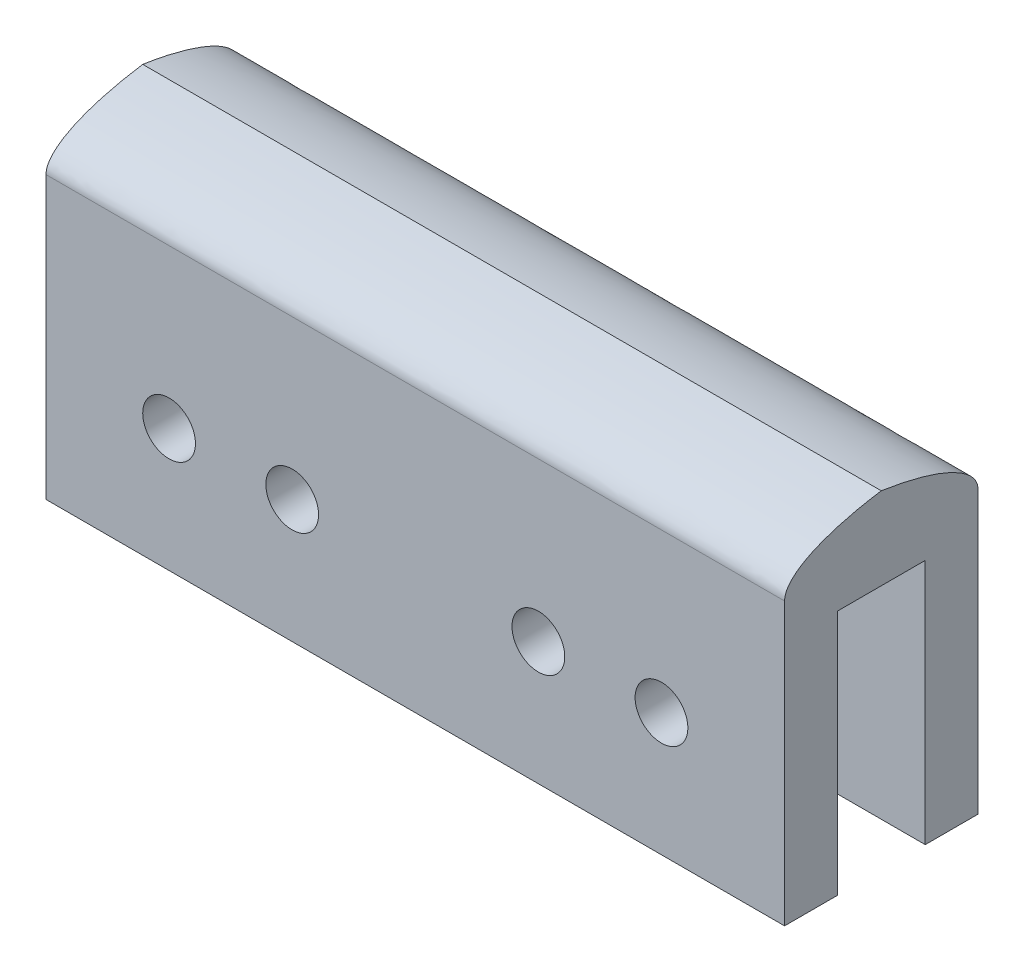
ISO-10303-21;
HEADER;
FILE_DESCRIPTION(('STEP AP214'),'2;1');
FILE_NAME('part.step','',(''),(''),'','','');
FILE_SCHEMA(('AUTOMOTIVE_DESIGN { 1 0 10303 214 1 1 1 1 }'));
ENDSEC;
DATA;
#1=APPLICATION_CONTEXT('core data for automotive mechanical design processes');
#2=APPLICATION_PROTOCOL_DEFINITION('international standard','automotive_design',2000,#1);
#3=PRODUCT_CONTEXT('',#1,'mechanical');
#4=PRODUCT('Part','Part','',(#3));
#5=PRODUCT_RELATED_PRODUCT_CATEGORY('part','',(#4));
#6=PRODUCT_DEFINITION_FORMATION('','',#4);
#7=PRODUCT_DEFINITION_CONTEXT('part definition',#1,'design');
#8=PRODUCT_DEFINITION('design','',#6,#7);
#9=PRODUCT_DEFINITION_SHAPE('','',#8);
#10=(LENGTH_UNIT() NAMED_UNIT(*) SI_UNIT(.MILLI.,.METRE.));
#11=(NAMED_UNIT(*) PLANE_ANGLE_UNIT() SI_UNIT($,.RADIAN.));
#12=(NAMED_UNIT(*) SI_UNIT($,.STERADIAN.) SOLID_ANGLE_UNIT());
#13=UNCERTAINTY_MEASURE_WITH_UNIT(LENGTH_MEASURE(1.E-05),#10,'distance_accuracy_value','');
#14=(GEOMETRIC_REPRESENTATION_CONTEXT(3) GLOBAL_UNCERTAINTY_ASSIGNED_CONTEXT((#13)) GLOBAL_UNIT_ASSIGNED_CONTEXT((#10,
#11,#12)) REPRESENTATION_CONTEXT('',''));
#15=CARTESIAN_POINT('',(0.,0.,0.));
#16=DIRECTION('',(0.,0.,1.));
#17=DIRECTION('',(1.,0.,0.));
#18=AXIS2_PLACEMENT_3D('',#15,#16,#17);
#19=CARTESIAN_POINT('',(0.,14.,0.));
#20=DIRECTION('',(1.,0.,0.));
#21=DIRECTION('',(0.,0.,-1.));
#22=AXIS2_PLACEMENT_3D('',#19,#20,#21);
#23=PLANE('',#22);
#24=CARTESIAN_POINT('',(0.,19.,0.999999999999999));
#25=CARTESIAN_POINT('',(0.,19.,11.));
#26=CARTESIAN_POINT('',(0.,16.,11.));
#27=(BOUNDED_CURVE() B_SPLINE_CURVE(2,(#24,#25,#26),.UNSPECIFIED.,.F.,
.F.) B_SPLINE_CURVE_WITH_KNOTS((3,3),(0.,1.),
.UNSPECIFIED.) CURVE() GEOMETRIC_REPRESENTATION_ITEM() RATIONAL_B_SPLINE_CURVE((1.,
0.707106781186548,1.)) REPRESENTATION_ITEM(''));
#28=CARTESIAN_POINT('',(0.,16.,11.));
#29=VERTEX_POINT('',#28);
#30=CARTESIAN_POINT('',(0.,18.6791763800223,5.50001372632784));
#31=VERTEX_POINT('',#30);
#32=EDGE_CURVE('E283',#29,#31,#27,.F.);
#33=ORIENTED_EDGE('',*,*,#32,.T.);
#34=CARTESIAN_POINT('',(0.,16.,0.));
#35=CARTESIAN_POINT('',(0.,19.,0.));
#36=CARTESIAN_POINT('',(0.,19.,10.));
#37=(BOUNDED_CURVE() B_SPLINE_CURVE(2,(#34,#35,#36),.UNSPECIFIED.,.F.,
.F.) B_SPLINE_CURVE_WITH_KNOTS((3,3),(0.,1.),
.UNSPECIFIED.) CURVE() GEOMETRIC_REPRESENTATION_ITEM() RATIONAL_B_SPLINE_CURVE((1.,
0.707106781186548,1.)) REPRESENTATION_ITEM(''));
#38=CARTESIAN_POINT('',(0.,16.,0.));
#39=VERTEX_POINT('',#38);
#40=EDGE_CURVE('E291',#31,#39,#37,.F.);
#41=ORIENTED_EDGE('',*,*,#40,.T.);
#42=DIRECTION('',(0.,-1.,0.));
#43=VECTOR('',#42,1.);
#44=CARTESIAN_POINT('',(0.,14.,0.));
#45=LINE('',#44,#43);
#46=CARTESIAN_POINT('',(0.,0.,0.));
#47=VERTEX_POINT('',#46);
#48=EDGE_CURVE('E272',#39,#47,#45,.T.);
#49=ORIENTED_EDGE('',*,*,#48,.T.);
#50=DIRECTION('',(0.,0.,1.));
#51=VECTOR('',#50,1.);
#52=CARTESIAN_POINT('',(0.,0.,0.));
#53=LINE('',#52,#51);
#54=CARTESIAN_POINT('',(0.,0.,3.));
#55=VERTEX_POINT('',#54);
#56=EDGE_CURVE('E324',#47,#55,#53,.T.);
#57=ORIENTED_EDGE('',*,*,#56,.T.);
#58=DIRECTION('',(0.,-1.,0.));
#59=VECTOR('',#58,1.);
#60=CARTESIAN_POINT('',(0.,14.,3.));
#61=LINE('',#60,#59);
#62=CARTESIAN_POINT('',(0.,14.,3.));
#63=VERTEX_POINT('',#62);
#64=EDGE_CURVE('E148',#63,#55,#61,.T.);
#65=ORIENTED_EDGE('',*,*,#64,.F.);
#66=DIRECTION('',(0.,0.,1.));
#67=VECTOR('',#66,1.);
#68=CARTESIAN_POINT('',(0.,14.,11.));
#69=LINE('',#68,#67);
#70=CARTESIAN_POINT('',(0.,14.,8.));
#71=VERTEX_POINT('',#70);
#72=EDGE_CURVE('E133',#63,#71,#69,.T.);
#73=ORIENTED_EDGE('',*,*,#72,.T.);
#74=DIRECTION('',(0.,-1.,0.));
#75=VECTOR('',#74,1.);
#76=CARTESIAN_POINT('',(0.,14.,8.));
#77=LINE('',#76,#75);
#78=CARTESIAN_POINT('',(0.,0.,8.));
#79=VERTEX_POINT('',#78);
#80=EDGE_CURVE('E121',#71,#79,#77,.T.);
#81=ORIENTED_EDGE('',*,*,#80,.T.);
#82=DIRECTION('',(0.,0.,1.));
#83=VECTOR('',#82,1.);
#84=CARTESIAN_POINT('',(0.,0.,0.));
#85=LINE('',#84,#83);
#86=CARTESIAN_POINT('',(0.,0.,11.));
#87=VERTEX_POINT('',#86);
#88=EDGE_CURVE('E418',#79,#87,#85,.T.);
#89=ORIENTED_EDGE('',*,*,#88,.T.);
#90=DIRECTION('',(0.,-1.,0.));
#91=VECTOR('',#90,1.);
#92=CARTESIAN_POINT('',(0.,19.,11.));
#93=LINE('',#92,#91);
#94=EDGE_CURVE('E165',#29,#87,#93,.T.);
#95=ORIENTED_EDGE('',*,*,#94,.F.);
#96=EDGE_LOOP('',(#33,#41,#49,#57,#65,#73,#81,#89,#95));
#97=FACE_BOUND('',#96,.T.);
#98=ADVANCED_FACE('F46',(#97),#23,.F.);
#99=CARTESIAN_POINT('',(0.,14.,3.));
#100=DIRECTION('',(0.,0.,-1.));
#101=DIRECTION('',(-1.,0.,0.));
#102=AXIS2_PLACEMENT_3D('',#99,#100,#101);
#103=PLANE('',#102);
#104=CARTESIAN_POINT('',(35.,7.,3.));
#105=DIRECTION('',(0.,0.,-1.));
#106=DIRECTION('',(-1.,0.,0.));
#107=AXIS2_PLACEMENT_3D('',#104,#105,#106);
#108=CIRCLE('',#107,1.5);
#109=CARTESIAN_POINT('',(33.5,7.,3.));
#110=VERTEX_POINT('',#109);
#111=EDGE_CURVE('E332',#110,#110,#108,.T.);
#112=ORIENTED_EDGE('',*,*,#111,.T.);
#113=EDGE_LOOP('',(#112));
#114=FACE_BOUND('',#113,.T.);
#115=CARTESIAN_POINT('',(28.,7.,3.));
#116=DIRECTION('',(0.,0.,-1.));
#117=DIRECTION('',(-1.,0.,0.));
#118=AXIS2_PLACEMENT_3D('',#115,#116,#117);
#119=CIRCLE('',#118,1.5);
#120=CARTESIAN_POINT('',(26.5,7.,3.));
#121=VERTEX_POINT('',#120);
#122=EDGE_CURVE('E337',#121,#121,#119,.T.);
#123=ORIENTED_EDGE('',*,*,#122,.T.);
#124=EDGE_LOOP('',(#123));
#125=FACE_BOUND('',#124,.T.);
#126=CARTESIAN_POINT('',(7.,7.,3.));
#127=DIRECTION('',(0.,0.,-1.));
#128=DIRECTION('',(-1.,0.,0.));
#129=AXIS2_PLACEMENT_3D('',#126,#127,#128);
#130=CIRCLE('',#129,1.5);
#131=CARTESIAN_POINT('',(5.5,7.,3.));
#132=VERTEX_POINT('',#131);
#133=EDGE_CURVE('E341',#132,#132,#130,.T.);
#134=ORIENTED_EDGE('',*,*,#133,.T.);
#135=EDGE_LOOP('',(#134));
#136=FACE_BOUND('',#135,.T.);
#137=CARTESIAN_POINT('',(14.,7.,3.));
#138=DIRECTION('',(0.,0.,-1.));
#139=DIRECTION('',(-1.,0.,0.));
#140=AXIS2_PLACEMENT_3D('',#137,#138,#139);
#141=CIRCLE('',#140,1.5);
#142=CARTESIAN_POINT('',(12.5,7.,3.));
#143=VERTEX_POINT('',#142);
#144=EDGE_CURVE('E345',#143,#143,#141,.T.);
#145=ORIENTED_EDGE('',*,*,#144,.T.);
#146=EDGE_LOOP('',(#145));
#147=FACE_BOUND('',#146,.T.);
#148=DIRECTION('',(1.,0.,0.));
#149=VECTOR('',#148,1.);
#150=CARTESIAN_POINT('',(0.,0.,3.));
#151=LINE('',#150,#149);
#152=CARTESIAN_POINT('',(42.,0.,3.));
#153=VERTEX_POINT('',#152);
#154=EDGE_CURVE('E322',#55,#153,#151,.T.);
#155=ORIENTED_EDGE('',*,*,#154,.T.);
#156=DIRECTION('',(0.,-1.,0.));
#157=VECTOR('',#156,1.);
#158=CARTESIAN_POINT('',(42.,14.,3.));
#159=LINE('',#158,#157);
#160=CARTESIAN_POINT('',(42.,14.,3.));
#161=VERTEX_POINT('',#160);
#162=EDGE_CURVE('E271',#161,#153,#159,.T.);
#163=ORIENTED_EDGE('',*,*,#162,.F.);
#164=DIRECTION('',(1.,0.,0.));
#165=VECTOR('',#164,1.);
#166=CARTESIAN_POINT('',(0.,14.,3.));
#167=LINE('',#166,#165);
#168=EDGE_CURVE('E288',#63,#161,#167,.T.);
#169=ORIENTED_EDGE('',*,*,#168,.F.);
#170=ORIENTED_EDGE('',*,*,#64,.T.);
#171=EDGE_LOOP('',(#155,#163,#169,#170));
#172=FACE_BOUND('',#171,.T.);
#173=ADVANCED_FACE('F185',(#114,#125,#136,#147,#172),#103,.F.);
#174=CARTESIAN_POINT('',(42.,14.,0.));
#175=DIRECTION('',(1.,0.,0.));
#176=DIRECTION('',(0.,0.,-1.));
#177=AXIS2_PLACEMENT_3D('',#174,#175,#176);
#178=PLANE('',#177);
#179=DIRECTION('',(0.,-1.,0.));
#180=VECTOR('',#179,1.);
#181=CARTESIAN_POINT('',(42.,14.,0.));
#182=LINE('',#181,#180);
#183=CARTESIAN_POINT('',(42.,16.,0.));
#184=VERTEX_POINT('',#183);
#185=CARTESIAN_POINT('',(42.,0.,0.));
#186=VERTEX_POINT('',#185);
#187=EDGE_CURVE('E263',#184,#186,#182,.T.);
#188=ORIENTED_EDGE('',*,*,#187,.F.);
#189=CARTESIAN_POINT('',(42.,19.,10.));
#190=CARTESIAN_POINT('',(42.,19.,0.));
#191=CARTESIAN_POINT('',(42.,16.,0.));
#192=(BOUNDED_CURVE() B_SPLINE_CURVE(2,(#189,#190,#191),.UNSPECIFIED.,.F.,
.F.) B_SPLINE_CURVE_WITH_KNOTS((3,3),(0.,1.),
.UNSPECIFIED.) CURVE() GEOMETRIC_REPRESENTATION_ITEM() RATIONAL_B_SPLINE_CURVE((1.,
0.707106781186548,1.)) REPRESENTATION_ITEM(''));
#193=CARTESIAN_POINT('',(42.,18.6791716965776,5.50001301919818));
#194=VERTEX_POINT('',#193);
#195=EDGE_CURVE('E61',#184,#194,#192,.F.);
#196=ORIENTED_EDGE('',*,*,#195,.T.);
#197=CARTESIAN_POINT('',(42.,16.,11.));
#198=CARTESIAN_POINT('',(42.,19.,11.));
#199=CARTESIAN_POINT('',(42.,19.,0.999999999999999));
#200=(BOUNDED_CURVE() B_SPLINE_CURVE(2,(#197,#198,#199),.UNSPECIFIED.,.F.,
.F.) B_SPLINE_CURVE_WITH_KNOTS((3,3),(0.,1.),
.UNSPECIFIED.) CURVE() GEOMETRIC_REPRESENTATION_ITEM() RATIONAL_B_SPLINE_CURVE((1.,
0.707106781186548,1.)) REPRESENTATION_ITEM(''));
#201=CARTESIAN_POINT('',(42.,16.,11.));
#202=VERTEX_POINT('',#201);
#203=EDGE_CURVE('E72',#194,#202,#200,.F.);
#204=ORIENTED_EDGE('',*,*,#203,.T.);
#205=DIRECTION('',(0.,-1.,0.));
#206=VECTOR('',#205,1.);
#207=CARTESIAN_POINT('',(42.,19.,11.));
#208=LINE('',#207,#206);
#209=CARTESIAN_POINT('',(42.,0.,11.));
#210=VERTEX_POINT('',#209);
#211=EDGE_CURVE('E152',#202,#210,#208,.T.);
#212=ORIENTED_EDGE('',*,*,#211,.T.);
#213=DIRECTION('',(0.,0.,1.));
#214=VECTOR('',#213,1.);
#215=CARTESIAN_POINT('',(42.,0.,0.));
#216=LINE('',#215,#214);
#217=CARTESIAN_POINT('',(42.,0.,8.));
#218=VERTEX_POINT('',#217);
#219=EDGE_CURVE('E143',#218,#210,#216,.T.);
#220=ORIENTED_EDGE('',*,*,#219,.F.);
#221=DIRECTION('',(0.,-1.,0.));
#222=VECTOR('',#221,1.);
#223=CARTESIAN_POINT('',(42.,14.,8.));
#224=LINE('',#223,#222);
#225=CARTESIAN_POINT('',(42.,14.,8.));
#226=VERTEX_POINT('',#225);
#227=EDGE_CURVE('E134',#226,#218,#224,.T.);
#228=ORIENTED_EDGE('',*,*,#227,.F.);
#229=DIRECTION('',(0.,0.,-1.));
#230=VECTOR('',#229,1.);
#231=CARTESIAN_POINT('',(42.,14.,11.));
#232=LINE('',#231,#230);
#233=EDGE_CURVE('E141',#226,#161,#232,.T.);
#234=ORIENTED_EDGE('',*,*,#233,.T.);
#235=ORIENTED_EDGE('',*,*,#162,.T.);
#236=DIRECTION('',(0.,0.,1.));
#237=VECTOR('',#236,1.);
#238=CARTESIAN_POINT('',(42.,0.,0.));
#239=LINE('',#238,#237);
#240=EDGE_CURVE('E316',#186,#153,#239,.T.);
#241=ORIENTED_EDGE('',*,*,#240,.F.);
#242=EDGE_LOOP('',(#188,#196,#204,#212,#220,#228,#234,#235,#241));
#243=FACE_BOUND('',#242,.T.);
#244=ADVANCED_FACE('F175',(#243),#178,.T.);
#245=CARTESIAN_POINT('',(0.,14.,0.));
#246=DIRECTION('',(0.,0.,-1.));
#247=DIRECTION('',(-1.,0.,0.));
#248=AXIS2_PLACEMENT_3D('',#245,#246,#247);
#249=PLANE('',#248);
#250=CARTESIAN_POINT('',(35.,7.,0.));
#251=DIRECTION('',(0.,0.,-1.));
#252=DIRECTION('',(-1.,0.,0.));
#253=AXIS2_PLACEMENT_3D('',#250,#251,#252);
#254=CIRCLE('',#253,1.5);
#255=CARTESIAN_POINT('',(33.5,7.,0.));
#256=VERTEX_POINT('',#255);
#257=EDGE_CURVE('E349',#256,#256,#254,.T.);
#258=ORIENTED_EDGE('',*,*,#257,.F.);
#259=EDGE_LOOP('',(#258));
#260=FACE_BOUND('',#259,.T.);
#261=CARTESIAN_POINT('',(28.,7.,0.));
#262=DIRECTION('',(0.,0.,-1.));
#263=DIRECTION('',(-1.,0.,0.));
#264=AXIS2_PLACEMENT_3D('',#261,#262,#263);
#265=CIRCLE('',#264,1.5);
#266=CARTESIAN_POINT('',(26.5,7.,0.));
#267=VERTEX_POINT('',#266);
#268=EDGE_CURVE('E357',#267,#267,#265,.T.);
#269=ORIENTED_EDGE('',*,*,#268,.F.);
#270=EDGE_LOOP('',(#269));
#271=FACE_BOUND('',#270,.T.);
#272=CARTESIAN_POINT('',(7.,7.,0.));
#273=DIRECTION('',(0.,0.,-1.));
#274=DIRECTION('',(-1.,0.,0.));
#275=AXIS2_PLACEMENT_3D('',#272,#273,#274);
#276=CIRCLE('',#275,1.5);
#277=CARTESIAN_POINT('',(5.5,7.,0.));
#278=VERTEX_POINT('',#277);
#279=EDGE_CURVE('E353',#278,#278,#276,.T.);
#280=ORIENTED_EDGE('',*,*,#279,.F.);
#281=EDGE_LOOP('',(#280));
#282=FACE_BOUND('',#281,.T.);
#283=CARTESIAN_POINT('',(14.,7.,0.));
#284=DIRECTION('',(0.,0.,-1.));
#285=DIRECTION('',(-1.,0.,0.));
#286=AXIS2_PLACEMENT_3D('',#283,#284,#285);
#287=CIRCLE('',#286,1.5);
#288=CARTESIAN_POINT('',(12.5,7.,0.));
#289=VERTEX_POINT('',#288);
#290=EDGE_CURVE('E286',#289,#289,#287,.T.);
#291=ORIENTED_EDGE('',*,*,#290,.F.);
#292=EDGE_LOOP('',(#291));
#293=FACE_BOUND('',#292,.T.);
#294=ORIENTED_EDGE('',*,*,#48,.F.);
#295=CARTESIAN_POINT('',(44.1,16.,0.));
#296=CARTESIAN_POINT('',(28.7,16.,0.));
#297=CARTESIAN_POINT('',(13.3,16.,0.));
#298=CARTESIAN_POINT('',(-2.1,16.,0.));
#299=(BOUNDED_CURVE() B_SPLINE_CURVE(3,(#295,#296,#297,#298),.UNSPECIFIED.,.F.,
.F.) B_SPLINE_CURVE_WITH_KNOTS((4,4),(-0.0021,0.0441),
.UNSPECIFIED.) CURVE() GEOMETRIC_REPRESENTATION_ITEM() RATIONAL_B_SPLINE_CURVE((1.,1.,1.,1.)) REPRESENTATION_ITEM(''));
#300=EDGE_CURVE('E306',#39,#184,#299,.F.);
#301=ORIENTED_EDGE('',*,*,#300,.T.);
#302=ORIENTED_EDGE('',*,*,#187,.T.);
#303=DIRECTION('',(1.,0.,0.));
#304=VECTOR('',#303,1.);
#305=CARTESIAN_POINT('',(0.,0.,0.));
#306=LINE('',#305,#304);
#307=EDGE_CURVE('E321',#47,#186,#306,.T.);
#308=ORIENTED_EDGE('',*,*,#307,.F.);
#309=EDGE_LOOP('',(#294,#301,#302,#308));
#310=FACE_BOUND('',#309,.T.);
#311=ADVANCED_FACE('F184',(#260,#271,#282,#293,#310),#249,.T.);
#312=CARTESIAN_POINT('',(0.,0.,0.));
#313=DIRECTION('',(0.,1.,0.));
#314=DIRECTION('',(0.,0.,1.));
#315=AXIS2_PLACEMENT_3D('',#312,#313,#314);
#316=PLANE('',#315);
#317=ORIENTED_EDGE('',*,*,#56,.F.);
#318=ORIENTED_EDGE('',*,*,#307,.T.);
#319=ORIENTED_EDGE('',*,*,#240,.T.);
#320=ORIENTED_EDGE('',*,*,#154,.F.);
#321=EDGE_LOOP('',(#317,#318,#319,#320));
#322=FACE_BOUND('',#321,.T.);
#323=ADVANCED_FACE('F233',(#322),#316,.F.);
#324=CARTESIAN_POINT('',(14.,7.,14.));
#325=DIRECTION('',(0.,0.,-1.));
#326=DIRECTION('',(-1.,0.,0.));
#327=AXIS2_PLACEMENT_3D('',#324,#325,#326);
#328=CYLINDRICAL_SURFACE('',#327,1.5);
#329=ORIENTED_EDGE('',*,*,#290,.T.);
#330=EDGE_LOOP('',(#329));
#331=FACE_BOUND('',#330,.T.);
#332=ORIENTED_EDGE('',*,*,#144,.F.);
#333=EDGE_LOOP('',(#332));
#334=FACE_BOUND('',#333,.T.);
#335=ADVANCED_FACE('F230',(#331,#334),#328,.F.);
#336=CARTESIAN_POINT('',(7.,7.,14.));
#337=DIRECTION('',(0.,0.,-1.));
#338=DIRECTION('',(-1.,0.,0.));
#339=AXIS2_PLACEMENT_3D('',#336,#337,#338);
#340=CYLINDRICAL_SURFACE('',#339,1.5);
#341=ORIENTED_EDGE('',*,*,#279,.T.);
#342=EDGE_LOOP('',(#341));
#343=FACE_BOUND('',#342,.T.);
#344=ORIENTED_EDGE('',*,*,#133,.F.);
#345=EDGE_LOOP('',(#344));
#346=FACE_BOUND('',#345,.T.);
#347=ADVANCED_FACE('F226',(#343,#346),#340,.F.);
#348=CARTESIAN_POINT('',(28.,7.,14.));
#349=DIRECTION('',(0.,0.,-1.));
#350=DIRECTION('',(-1.,0.,0.));
#351=AXIS2_PLACEMENT_3D('',#348,#349,#350);
#352=CYLINDRICAL_SURFACE('',#351,1.5);
#353=ORIENTED_EDGE('',*,*,#268,.T.);
#354=EDGE_LOOP('',(#353));
#355=FACE_BOUND('',#354,.T.);
#356=ORIENTED_EDGE('',*,*,#122,.F.);
#357=EDGE_LOOP('',(#356));
#358=FACE_BOUND('',#357,.T.);
#359=ADVANCED_FACE('F222',(#355,#358),#352,.F.);
#360=CARTESIAN_POINT('',(35.,7.,14.));
#361=DIRECTION('',(0.,0.,-1.));
#362=DIRECTION('',(-1.,0.,0.));
#363=AXIS2_PLACEMENT_3D('',#360,#361,#362);
#364=CYLINDRICAL_SURFACE('',#363,1.5);
#365=ORIENTED_EDGE('',*,*,#257,.T.);
#366=EDGE_LOOP('',(#365));
#367=FACE_BOUND('',#366,.T.);
#368=ORIENTED_EDGE('',*,*,#111,.F.);
#369=EDGE_LOOP('',(#368));
#370=FACE_BOUND('',#369,.T.);
#371=ADVANCED_FACE('F218',(#367,#370),#364,.F.);
#372=CARTESIAN_POINT('',(0.,19.,11.));
#373=DIRECTION('',(0.,0.,-1.));
#374=DIRECTION('',(-1.,0.,0.));
#375=AXIS2_PLACEMENT_3D('',#372,#373,#374);
#376=PLANE('',#375);
#377=ORIENTED_EDGE('',*,*,#211,.F.);
#378=CARTESIAN_POINT('',(-2.1,16.,11.));
#379=CARTESIAN_POINT('',(13.3,16.,11.));
#380=CARTESIAN_POINT('',(28.7,16.,11.));
#381=CARTESIAN_POINT('',(44.1,16.,11.));
#382=(BOUNDED_CURVE() B_SPLINE_CURVE(3,(#378,#379,#380,#381),.UNSPECIFIED.,.F.,
.F.) B_SPLINE_CURVE_WITH_KNOTS((4,4),(-0.0021,0.0441),
.UNSPECIFIED.) CURVE() GEOMETRIC_REPRESENTATION_ITEM() RATIONAL_B_SPLINE_CURVE((1.,1.,1.,1.)) REPRESENTATION_ITEM(''));
#383=EDGE_CURVE('E12',#202,#29,#382,.F.);
#384=ORIENTED_EDGE('',*,*,#383,.T.);
#385=ORIENTED_EDGE('',*,*,#94,.T.);
#386=DIRECTION('',(1.,0.,0.));
#387=VECTOR('',#386,1.);
#388=CARTESIAN_POINT('',(0.,0.,11.));
#389=LINE('',#388,#387);
#390=EDGE_CURVE('E420',#87,#210,#389,.T.);
#391=ORIENTED_EDGE('',*,*,#390,.T.);
#392=EDGE_LOOP('',(#377,#384,#385,#391));
#393=FACE_BOUND('',#392,.T.);
#394=CARTESIAN_POINT('',(35.,7.,11.));
#395=DIRECTION('',(0.,0.,-1.));
#396=DIRECTION('',(-1.,0.,0.));
#397=AXIS2_PLACEMENT_3D('',#394,#395,#396);
#398=CIRCLE('',#397,1.5);
#399=CARTESIAN_POINT('',(33.5,7.,11.));
#400=VERTEX_POINT('',#399);
#401=EDGE_CURVE('E155',#400,#400,#398,.T.);
#402=ORIENTED_EDGE('',*,*,#401,.T.);
#403=EDGE_LOOP('',(#402));
#404=FACE_BOUND('',#403,.T.);
#405=CARTESIAN_POINT('',(28.,7.,11.));
#406=DIRECTION('',(0.,0.,-1.));
#407=DIRECTION('',(-1.,0.,0.));
#408=AXIS2_PLACEMENT_3D('',#405,#406,#407);
#409=CIRCLE('',#408,1.5);
#410=CARTESIAN_POINT('',(26.5,7.,11.));
#411=VERTEX_POINT('',#410);
#412=EDGE_CURVE('E396',#411,#411,#409,.T.);
#413=ORIENTED_EDGE('',*,*,#412,.T.);
#414=EDGE_LOOP('',(#413));
#415=FACE_BOUND('',#414,.T.);
#416=CARTESIAN_POINT('',(7.,7.,11.));
#417=DIRECTION('',(0.,0.,-1.));
#418=DIRECTION('',(-1.,0.,0.));
#419=AXIS2_PLACEMENT_3D('',#416,#417,#418);
#420=CIRCLE('',#419,1.5);
#421=CARTESIAN_POINT('',(5.5,7.,11.));
#422=VERTEX_POINT('',#421);
#423=EDGE_CURVE('E392',#422,#422,#420,.T.);
#424=ORIENTED_EDGE('',*,*,#423,.T.);
#425=EDGE_LOOP('',(#424));
#426=FACE_BOUND('',#425,.T.);
#427=CARTESIAN_POINT('',(14.,7.,11.));
#428=DIRECTION('',(0.,0.,-1.));
#429=DIRECTION('',(-1.,0.,0.));
#430=AXIS2_PLACEMENT_3D('',#427,#428,#429);
#431=CIRCLE('',#430,1.5);
#432=CARTESIAN_POINT('',(12.5,7.,11.));
#433=VERTEX_POINT('',#432);
#434=EDGE_CURVE('E302',#433,#433,#431,.T.);
#435=ORIENTED_EDGE('',*,*,#434,.T.);
#436=EDGE_LOOP('',(#435));
#437=FACE_BOUND('',#436,.T.);
#438=ADVANCED_FACE('F208',(#393,#404,#415,#426,#437),#376,.F.);
#439=CARTESIAN_POINT('',(0.,14.,0.));
#440=DIRECTION('',(0.,-1.,0.));
#441=DIRECTION('',(0.,0.,-1.));
#442=AXIS2_PLACEMENT_3D('',#439,#440,#441);
#443=PLANE('',#442);
#444=DIRECTION('',(1.,0.,0.));
#445=VECTOR('',#444,1.);
#446=CARTESIAN_POINT('',(0.,14.,8.));
#447=LINE('',#446,#445);
#448=EDGE_CURVE('E124',#71,#226,#447,.T.);
#449=ORIENTED_EDGE('',*,*,#448,.F.);
#450=ORIENTED_EDGE('',*,*,#72,.F.);
#451=ORIENTED_EDGE('',*,*,#168,.T.);
#452=ORIENTED_EDGE('',*,*,#233,.F.);
#453=EDGE_LOOP('',(#449,#450,#451,#452));
#454=FACE_BOUND('',#453,.T.);
#455=ADVANCED_FACE('F139',(#454),#443,.T.);
#456=CARTESIAN_POINT('',(0.,14.,8.));
#457=DIRECTION('',(0.,0.,-1.));
#458=DIRECTION('',(-1.,0.,0.));
#459=AXIS2_PLACEMENT_3D('',#456,#457,#458);
#460=PLANE('',#459);
#461=CARTESIAN_POINT('',(35.,7.,8.));
#462=DIRECTION('',(0.,0.,-1.));
#463=DIRECTION('',(-1.,0.,0.));
#464=AXIS2_PLACEMENT_3D('',#461,#462,#463);
#465=CIRCLE('',#464,1.5);
#466=CARTESIAN_POINT('',(33.5,7.,8.));
#467=VERTEX_POINT('',#466);
#468=EDGE_CURVE('E412',#467,#467,#465,.T.);
#469=ORIENTED_EDGE('',*,*,#468,.F.);
#470=EDGE_LOOP('',(#469));
#471=FACE_BOUND('',#470,.T.);
#472=CARTESIAN_POINT('',(28.,7.,8.));
#473=DIRECTION('',(0.,0.,-1.));
#474=DIRECTION('',(-1.,0.,0.));
#475=AXIS2_PLACEMENT_3D('',#472,#473,#474);
#476=CIRCLE('',#475,1.5);
#477=CARTESIAN_POINT('',(26.5,7.,8.));
#478=VERTEX_POINT('',#477);
#479=EDGE_CURVE('E399',#478,#478,#476,.T.);
#480=ORIENTED_EDGE('',*,*,#479,.F.);
#481=EDGE_LOOP('',(#480));
#482=FACE_BOUND('',#481,.T.);
#483=CARTESIAN_POINT('',(7.,7.,8.));
#484=DIRECTION('',(0.,0.,-1.));
#485=DIRECTION('',(-1.,0.,0.));
#486=AXIS2_PLACEMENT_3D('',#483,#484,#485);
#487=CIRCLE('',#486,1.5);
#488=CARTESIAN_POINT('',(5.5,7.,8.));
#489=VERTEX_POINT('',#488);
#490=EDGE_CURVE('E395',#489,#489,#487,.T.);
#491=ORIENTED_EDGE('',*,*,#490,.F.);
#492=EDGE_LOOP('',(#491));
#493=FACE_BOUND('',#492,.T.);
#494=CARTESIAN_POINT('',(14.,7.,8.));
#495=DIRECTION('',(0.,0.,-1.));
#496=DIRECTION('',(-1.,0.,0.));
#497=AXIS2_PLACEMENT_3D('',#494,#495,#496);
#498=CIRCLE('',#497,1.5);
#499=CARTESIAN_POINT('',(12.5,7.,8.));
#500=VERTEX_POINT('',#499);
#501=EDGE_CURVE('E391',#500,#500,#498,.T.);
#502=ORIENTED_EDGE('',*,*,#501,.F.);
#503=EDGE_LOOP('',(#502));
#504=FACE_BOUND('',#503,.T.);
#505=DIRECTION('',(1.,0.,0.));
#506=VECTOR('',#505,1.);
#507=CARTESIAN_POINT('',(0.,0.,8.));
#508=LINE('',#507,#506);
#509=EDGE_CURVE('E127',#79,#218,#508,.T.);
#510=ORIENTED_EDGE('',*,*,#509,.F.);
#511=ORIENTED_EDGE('',*,*,#80,.F.);
#512=ORIENTED_EDGE('',*,*,#448,.T.);
#513=ORIENTED_EDGE('',*,*,#227,.T.);
#514=EDGE_LOOP('',(#510,#511,#512,#513));
#515=FACE_BOUND('',#514,.T.);
#516=ADVANCED_FACE('F123',(#471,#482,#493,#504,#515),#460,.T.);
#517=CARTESIAN_POINT('',(0.,0.,0.));
#518=DIRECTION('',(0.,1.,0.));
#519=DIRECTION('',(0.,0.,1.));
#520=AXIS2_PLACEMENT_3D('',#517,#518,#519);
#521=PLANE('',#520);
#522=ORIENTED_EDGE('',*,*,#509,.T.);
#523=ORIENTED_EDGE('',*,*,#219,.T.);
#524=ORIENTED_EDGE('',*,*,#390,.F.);
#525=ORIENTED_EDGE('',*,*,#88,.F.);
#526=EDGE_LOOP('',(#522,#523,#524,#525));
#527=FACE_BOUND('',#526,.T.);
#528=ADVANCED_FACE('F426',(#527),#521,.F.);
#529=CARTESIAN_POINT('',(14.,7.,14.));
#530=DIRECTION('',(0.,0.,-1.));
#531=DIRECTION('',(-1.,0.,0.));
#532=AXIS2_PLACEMENT_3D('',#529,#530,#531);
#533=CYLINDRICAL_SURFACE('',#532,1.5);
#534=ORIENTED_EDGE('',*,*,#501,.T.);
#535=EDGE_LOOP('',(#534));
#536=FACE_BOUND('',#535,.T.);
#537=ORIENTED_EDGE('',*,*,#434,.F.);
#538=EDGE_LOOP('',(#537));
#539=FACE_BOUND('',#538,.T.);
#540=ADVANCED_FACE('F428',(#536,#539),#533,.F.);
#541=CARTESIAN_POINT('',(7.,7.,14.));
#542=DIRECTION('',(0.,0.,-1.));
#543=DIRECTION('',(-1.,0.,0.));
#544=AXIS2_PLACEMENT_3D('',#541,#542,#543);
#545=CYLINDRICAL_SURFACE('',#544,1.5);
#546=ORIENTED_EDGE('',*,*,#490,.T.);
#547=EDGE_LOOP('',(#546));
#548=FACE_BOUND('',#547,.T.);
#549=ORIENTED_EDGE('',*,*,#423,.F.);
#550=EDGE_LOOP('',(#549));
#551=FACE_BOUND('',#550,.T.);
#552=ADVANCED_FACE('F434',(#548,#551),#545,.F.);
#553=CARTESIAN_POINT('',(28.,7.,14.));
#554=DIRECTION('',(0.,0.,-1.));
#555=DIRECTION('',(-1.,0.,0.));
#556=AXIS2_PLACEMENT_3D('',#553,#554,#555);
#557=CYLINDRICAL_SURFACE('',#556,1.5);
#558=ORIENTED_EDGE('',*,*,#479,.T.);
#559=EDGE_LOOP('',(#558));
#560=FACE_BOUND('',#559,.T.);
#561=ORIENTED_EDGE('',*,*,#412,.F.);
#562=EDGE_LOOP('',(#561));
#563=FACE_BOUND('',#562,.T.);
#564=ADVANCED_FACE('F441',(#560,#563),#557,.F.);
#565=CARTESIAN_POINT('',(35.,7.,14.));
#566=DIRECTION('',(0.,0.,-1.));
#567=DIRECTION('',(-1.,0.,0.));
#568=AXIS2_PLACEMENT_3D('',#565,#566,#567);
#569=CYLINDRICAL_SURFACE('',#568,1.5);
#570=ORIENTED_EDGE('',*,*,#468,.T.);
#571=EDGE_LOOP('',(#570));
#572=FACE_BOUND('',#571,.T.);
#573=ORIENTED_EDGE('',*,*,#401,.F.);
#574=EDGE_LOOP('',(#573));
#575=FACE_BOUND('',#574,.T.);
#576=ADVANCED_FACE('F444',(#572,#575),#569,.F.);
#577=CARTESIAN_POINT('',(-2.1,19.,0.999999999999999));
#578=CARTESIAN_POINT('',(13.3,19.,0.999999999999999));
#579=CARTESIAN_POINT('',(28.7,19.,0.999999999999999));
#580=CARTESIAN_POINT('',(44.1,19.,0.999999999999999));
#581=CARTESIAN_POINT('',(-2.1,19.,11.));
#582=CARTESIAN_POINT('',(13.3,19.,11.));
#583=CARTESIAN_POINT('',(28.7,19.,11.));
#584=CARTESIAN_POINT('',(44.1,19.,11.));
#585=CARTESIAN_POINT('',(-2.1,16.,11.));
#586=CARTESIAN_POINT('',(13.3,16.,11.));
#587=CARTESIAN_POINT('',(28.7,16.,11.));
#588=CARTESIAN_POINT('',(44.1,16.,11.));
#589=(BOUNDED_SURFACE() B_SPLINE_SURFACE(2,3,((#577,#578,#579,#580),(#581,#582,#583,#584),(#585,
#586,#587,#588)),.UNSPECIFIED.,.F.,.F.,.F.) B_SPLINE_SURFACE_WITH_KNOTS((3,3),(4,4),(0.,1.),
(-0.0021,0.0441),.UNSPECIFIED.) GEOMETRIC_REPRESENTATION_ITEM() RATIONAL_B_SPLINE_SURFACE(((1.,
1.,1.,1.),(0.707106781186548,0.707106781186548,0.707106781186548,0.707106781186548),(1.,1.,1.,1.))) REPRESENTATION_ITEM('') SURFACE());
#590=CARTESIAN_POINT('',(-2.1,18.6790856649238,5.49999999999996));
#591=CARTESIAN_POINT('',(13.3,18.6790856649238,5.49999999999996));
#592=CARTESIAN_POINT('',(28.7,18.6790856649238,5.49999999999996));
#593=CARTESIAN_POINT('',(44.1,18.6790856649238,5.49999999999996));
#594=(BOUNDED_CURVE() B_SPLINE_CURVE(3,(#590,#591,#592,#593),.UNSPECIFIED.,.F.,
.F.) B_SPLINE_CURVE_WITH_KNOTS((4,4),(-0.0021,0.0441),
.UNSPECIFIED.) CURVE() GEOMETRIC_REPRESENTATION_ITEM() RATIONAL_B_SPLINE_CURVE((0.875589977094734,
0.875589977094734,0.875589977094734,0.875589977094734)) REPRESENTATION_ITEM(''));
#595=EDGE_CURVE('E297',#31,#194,#594,.T.);
#596=ORIENTED_EDGE('',*,*,#383,.F.);
#597=ORIENTED_EDGE('',*,*,#203,.F.);
#598=ORIENTED_EDGE('',*,*,#595,.F.);
#599=ORIENTED_EDGE('',*,*,#32,.F.);
#600=EDGE_LOOP('',(#596,#597,#598,#599));
#601=FACE_BOUND('',#600,.T.);
#602=ADVANCED_FACE('F49',(#601),#589,.T.);
#603=CARTESIAN_POINT('',(-2.1,16.,0.));
#604=CARTESIAN_POINT('',(13.3,16.,0.));
#605=CARTESIAN_POINT('',(28.7,16.,0.));
#606=CARTESIAN_POINT('',(44.1,16.,0.));
#607=CARTESIAN_POINT('',(-2.1,19.,0.));
#608=CARTESIAN_POINT('',(13.3,19.,0.));
#609=CARTESIAN_POINT('',(28.7,19.,0.));
#610=CARTESIAN_POINT('',(44.1,19.,0.));
#611=CARTESIAN_POINT('',(-2.1,19.,10.));
#612=CARTESIAN_POINT('',(13.3,19.,10.));
#613=CARTESIAN_POINT('',(28.7,19.,10.));
#614=CARTESIAN_POINT('',(44.1,19.,10.));
#615=(BOUNDED_SURFACE() B_SPLINE_SURFACE(2,3,((#603,#604,#605,#606),(#607,#608,#609,#610),(#611,
#612,#613,#614)),.UNSPECIFIED.,.F.,.F.,.F.) B_SPLINE_SURFACE_WITH_KNOTS((3,3),(4,4),(0.,1.),
(-0.0021,0.0441),.UNSPECIFIED.) GEOMETRIC_REPRESENTATION_ITEM() RATIONAL_B_SPLINE_SURFACE(((1.,
1.,1.,1.),(0.707106781186548,0.707106781186548,0.707106781186548,0.707106781186548),(1.,1.,1.,1.))) REPRESENTATION_ITEM('') SURFACE());
#616=ORIENTED_EDGE('',*,*,#195,.F.);
#617=ORIENTED_EDGE('',*,*,#300,.F.);
#618=ORIENTED_EDGE('',*,*,#40,.F.);
#619=ORIENTED_EDGE('',*,*,#595,.T.);
#620=EDGE_LOOP('',(#616,#617,#618,#619));
#621=FACE_BOUND('',#620,.T.);
#622=ADVANCED_FACE('F249',(#621),#615,.T.);
#623=CLOSED_SHELL('',(#98,#173,#244,#311,#323,#335,#347,#359,#371,#438,#455,#516,#528,#540,#552,
#564,#576,#602,#622));
#624=MANIFOLD_SOLID_BREP('B2',#623);
#625=ADVANCED_BREP_SHAPE_REPRESENTATION('',(#18,#624),#14);
#626=SHAPE_DEFINITION_REPRESENTATION(#9,#625);
ENDSEC;
END-ISO-10303-21;
